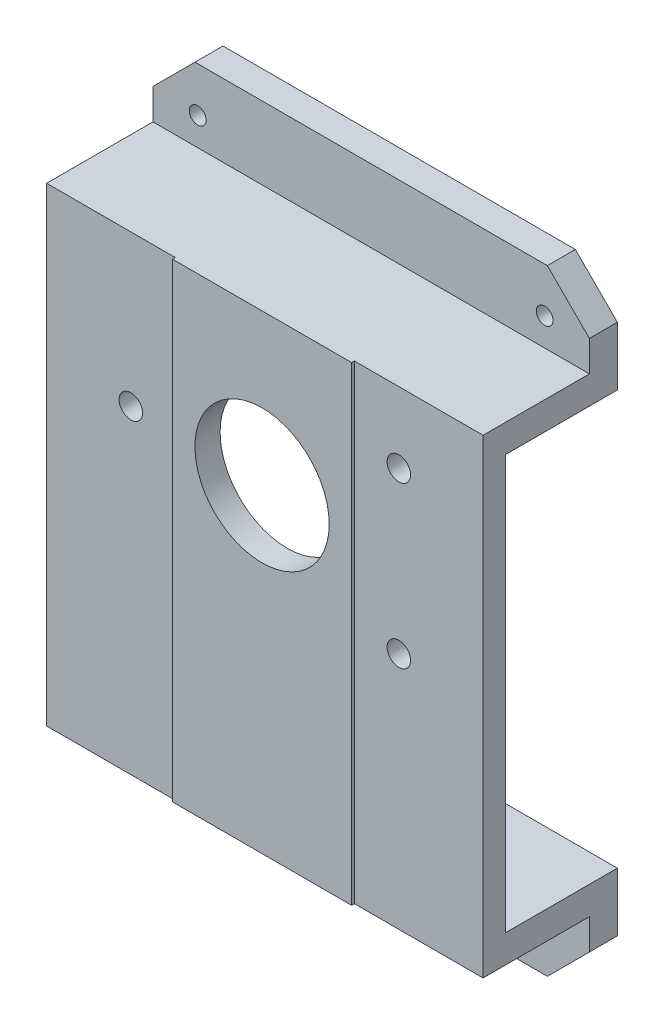
ISO-10303-21;
HEADER;
FILE_DESCRIPTION(('STEP AP214'),'2;1');
FILE_NAME('part.step','',(''),(''),'','','');
FILE_SCHEMA(('AUTOMOTIVE_DESIGN { 1 0 10303 214 1 1 1 1 }'));
ENDSEC;
DATA;
#1=APPLICATION_CONTEXT('core data for automotive mechanical design processes');
#2=APPLICATION_PROTOCOL_DEFINITION('international standard','automotive_design',2000,#1);
#3=PRODUCT_CONTEXT('',#1,'mechanical');
#4=PRODUCT('Part','Part','',(#3));
#5=PRODUCT_RELATED_PRODUCT_CATEGORY('part','',(#4));
#6=PRODUCT_DEFINITION_FORMATION('','',#4);
#7=PRODUCT_DEFINITION_CONTEXT('part definition',#1,'design');
#8=PRODUCT_DEFINITION('design','',#6,#7);
#9=PRODUCT_DEFINITION_SHAPE('','',#8);
#10=(LENGTH_UNIT() NAMED_UNIT(*) SI_UNIT(.MILLI.,.METRE.));
#11=(NAMED_UNIT(*) PLANE_ANGLE_UNIT() SI_UNIT($,.RADIAN.));
#12=(NAMED_UNIT(*) SI_UNIT($,.STERADIAN.) SOLID_ANGLE_UNIT());
#13=UNCERTAINTY_MEASURE_WITH_UNIT(LENGTH_MEASURE(1.E-05),#10,'distance_accuracy_value','');
#14=(GEOMETRIC_REPRESENTATION_CONTEXT(3) GLOBAL_UNCERTAINTY_ASSIGNED_CONTEXT((#13)) GLOBAL_UNIT_ASSIGNED_CONTEXT((#10,
#11,#12)) REPRESENTATION_CONTEXT('',''));
#15=CARTESIAN_POINT('',(0.,0.,0.));
#16=DIRECTION('',(0.,0.,1.));
#17=DIRECTION('',(1.,0.,0.));
#18=AXIS2_PLACEMENT_3D('',#15,#16,#17);
#19=CARTESIAN_POINT('',(126.361318671366,42.,24.));
#20=DIRECTION('',(0.,0.,1.));
#21=DIRECTION('',(0.,-1.,0.));
#22=AXIS2_PLACEMENT_3D('',#19,#20,#21);
#23=PLANE('',#22);
#24=CARTESIAN_POINT('',(-23.95,14.9999999999932,24.));
#25=DIRECTION('',(0.,0.,1.));
#26=DIRECTION('',(1.,0.,0.));
#27=AXIS2_PLACEMENT_3D('',#24,#25,#26);
#28=CIRCLE('',#27,2.1);
#29=CARTESIAN_POINT('',(-21.85,14.9999999999932,24.));
#30=VERTEX_POINT('',#29);
#31=EDGE_CURVE('E389',#30,#30,#28,.T.);
#32=ORIENTED_EDGE('',*,*,#31,.F.);
#33=EDGE_LOOP('',(#32));
#34=FACE_BOUND('',#33,.T.);
#35=DIRECTION('',(0.,-1.,0.));
#36=VECTOR('',#35,1.);
#37=CARTESIAN_POINT('',(-16.,42.,24.));
#38=LINE('',#37,#36);
#39=CARTESIAN_POINT('',(-16.,42.,24.));
#40=VERTEX_POINT('',#39);
#41=CARTESIAN_POINT('',(-16.,-42.,24.));
#42=VERTEX_POINT('',#41);
#43=EDGE_CURVE('E194',#40,#42,#38,.T.);
#44=ORIENTED_EDGE('',*,*,#43,.F.);
#45=DIRECTION('',(-1.,0.,0.));
#46=VECTOR('',#45,1.);
#47=CARTESIAN_POINT('',(126.361318671366,42.,24.));
#48=LINE('',#47,#46);
#49=CARTESIAN_POINT('',(-39.,42.,24.));
#50=VERTEX_POINT('',#49);
#51=EDGE_CURVE('E274',#40,#50,#48,.T.);
#52=ORIENTED_EDGE('',*,*,#51,.T.);
#53=DIRECTION('',(0.,1.,0.));
#54=VECTOR('',#53,1.);
#55=CARTESIAN_POINT('',(-39.,42.,24.));
#56=LINE('',#55,#54);
#57=CARTESIAN_POINT('',(-39.,-42.,24.));
#58=VERTEX_POINT('',#57);
#59=EDGE_CURVE('E266',#58,#50,#56,.T.);
#60=ORIENTED_EDGE('',*,*,#59,.F.);
#61=DIRECTION('',(-1.,0.,0.));
#62=VECTOR('',#61,1.);
#63=CARTESIAN_POINT('',(126.361318671366,-42.,24.));
#64=LINE('',#63,#62);
#65=EDGE_CURVE('E49',#42,#58,#64,.T.);
#66=ORIENTED_EDGE('',*,*,#65,.F.);
#67=EDGE_LOOP('',(#44,#52,#60,#66));
#68=FACE_BOUND('',#67,.T.);
#69=ADVANCED_FACE('F34',(#34,#68),#23,.T.);
#70=CARTESIAN_POINT('',(39.,42.,5.));
#71=DIRECTION('',(-1.,0.,0.));
#72=DIRECTION('',(0.,0.,1.));
#73=AXIS2_PLACEMENT_3D('',#70,#71,#72);
#74=PLANE('',#73);
#75=DIRECTION('',(0.,1.,0.));
#76=VECTOR('',#75,1.);
#77=CARTESIAN_POINT('',(39.,42.,0.));
#78=LINE('',#77,#76);
#79=CARTESIAN_POINT('',(39.,37.,0.));
#80=VERTEX_POINT('',#79);
#81=CARTESIAN_POINT('',(39.,47.4852813742386,0.));
#82=VERTEX_POINT('',#81);
#83=EDGE_CURVE('E287',#80,#82,#78,.T.);
#84=ORIENTED_EDGE('',*,*,#83,.T.);
#85=DIRECTION('',(0.,0.,-1.));
#86=VECTOR('',#85,1.);
#87=CARTESIAN_POINT('',(39.,47.4852813742386,5.));
#88=LINE('',#87,#86);
#89=CARTESIAN_POINT('',(39.,47.4852813742386,5.));
#90=VERTEX_POINT('',#89);
#91=EDGE_CURVE('E11',#90,#82,#88,.T.);
#92=ORIENTED_EDGE('',*,*,#91,.F.);
#93=DIRECTION('',(0.,1.,0.));
#94=VECTOR('',#93,1.);
#95=CARTESIAN_POINT('',(39.,42.,5.));
#96=LINE('',#95,#94);
#97=CARTESIAN_POINT('',(39.,42.,5.));
#98=VERTEX_POINT('',#97);
#99=EDGE_CURVE('E288',#98,#90,#96,.T.);
#100=ORIENTED_EDGE('',*,*,#99,.F.);
#101=DIRECTION('',(0.,0.,1.));
#102=VECTOR('',#101,1.);
#103=CARTESIAN_POINT('',(39.,42.,0.));
#104=LINE('',#103,#102);
#105=CARTESIAN_POINT('',(39.,42.,24.));
#106=VERTEX_POINT('',#105);
#107=EDGE_CURVE('E250',#98,#106,#104,.T.);
#108=ORIENTED_EDGE('',*,*,#107,.T.);
#109=DIRECTION('',(0.,-1.,0.));
#110=VECTOR('',#109,1.);
#111=CARTESIAN_POINT('',(39.,42.,24.));
#112=LINE('',#111,#110);
#113=CARTESIAN_POINT('',(39.,-42.,24.));
#114=VERTEX_POINT('',#113);
#115=EDGE_CURVE('E248',#106,#114,#112,.T.);
#116=ORIENTED_EDGE('',*,*,#115,.T.);
#117=DIRECTION('',(0.,0.,-1.));
#118=VECTOR('',#117,1.);
#119=CARTESIAN_POINT('',(39.,-42.,24.));
#120=LINE('',#119,#118);
#121=CARTESIAN_POINT('',(39.,-42.,5.));
#122=VERTEX_POINT('',#121);
#123=EDGE_CURVE('E245',#114,#122,#120,.T.);
#124=ORIENTED_EDGE('',*,*,#123,.T.);
#125=DIRECTION('',(0.,1.,0.));
#126=VECTOR('',#125,1.);
#127=CARTESIAN_POINT('',(39.,-42.,5.));
#128=LINE('',#127,#126);
#129=CARTESIAN_POINT('',(39.,-47.4852813742386,5.));
#130=VERTEX_POINT('',#129);
#131=EDGE_CURVE('E207',#130,#122,#128,.T.);
#132=ORIENTED_EDGE('',*,*,#131,.F.);
#133=DIRECTION('',(0.,0.,-1.));
#134=VECTOR('',#133,1.);
#135=CARTESIAN_POINT('',(39.,-47.4852813742386,5.));
#136=LINE('',#135,#134);
#137=CARTESIAN_POINT('',(39.,-47.4852813742386,0.));
#138=VERTEX_POINT('',#137);
#139=EDGE_CURVE('E234',#130,#138,#136,.T.);
#140=ORIENTED_EDGE('',*,*,#139,.T.);
#141=DIRECTION('',(0.,1.,0.));
#142=VECTOR('',#141,1.);
#143=CARTESIAN_POINT('',(39.,-42.,0.));
#144=LINE('',#143,#142);
#145=CARTESIAN_POINT('',(39.,-37.,0.));
#146=VERTEX_POINT('',#145);
#147=EDGE_CURVE('E243',#138,#146,#144,.T.);
#148=ORIENTED_EDGE('',*,*,#147,.T.);
#149=DIRECTION('',(0.,0.,1.));
#150=VECTOR('',#149,1.);
#151=CARTESIAN_POINT('',(39.,-37.,0.));
#152=LINE('',#151,#150);
#153=CARTESIAN_POINT('',(39.,-37.,20.));
#154=VERTEX_POINT('',#153);
#155=EDGE_CURVE('E240',#146,#154,#152,.T.);
#156=ORIENTED_EDGE('',*,*,#155,.T.);
#157=DIRECTION('',(0.,1.,0.));
#158=VECTOR('',#157,1.);
#159=CARTESIAN_POINT('',(39.,-37.,20.));
#160=LINE('',#159,#158);
#161=CARTESIAN_POINT('',(39.,37.,20.));
#162=VERTEX_POINT('',#161);
#163=EDGE_CURVE('E238',#154,#162,#160,.T.);
#164=ORIENTED_EDGE('',*,*,#163,.T.);
#165=DIRECTION('',(0.,0.,-1.));
#166=VECTOR('',#165,1.);
#167=CARTESIAN_POINT('',(39.,37.,20.));
#168=LINE('',#167,#166);
#169=EDGE_CURVE('E252',#162,#80,#168,.T.);
#170=ORIENTED_EDGE('',*,*,#169,.T.);
#171=EDGE_LOOP('',(#84,#92,#100,#108,#116,#124,#132,#140,#148,#156,#164,#170));
#172=FACE_BOUND('',#171,.T.);
#173=ADVANCED_FACE('F36',(#172),#74,.F.);
#174=CARTESIAN_POINT('',(39.,47.4852813742386,5.));
#175=DIRECTION('',(-0.707106781186548,-0.707106781186546,0.));
#176=DIRECTION('',(0.707106781186547,-0.707106781186549,0.));
#177=AXIS2_PLACEMENT_3D('',#174,#175,#176);
#178=PLANE('',#177);
#179=DIRECTION('',(-0.707106781186546,0.707106781186548,0.));
#180=VECTOR('',#179,1.);
#181=CARTESIAN_POINT('',(39.,47.4852813742386,0.));
#182=LINE('',#181,#180);
#183=CARTESIAN_POINT('',(31.4852813742386,55.,0.));
#184=VERTEX_POINT('',#183);
#185=EDGE_CURVE('E307',#82,#184,#182,.T.);
#186=ORIENTED_EDGE('',*,*,#185,.T.);
#187=DIRECTION('',(0.,0.,-1.));
#188=VECTOR('',#187,1.);
#189=CARTESIAN_POINT('',(31.4852813742386,55.,5.));
#190=LINE('',#189,#188);
#191=CARTESIAN_POINT('',(31.4852813742386,55.,5.));
#192=VERTEX_POINT('',#191);
#193=EDGE_CURVE('E42',#192,#184,#190,.T.);
#194=ORIENTED_EDGE('',*,*,#193,.F.);
#195=DIRECTION('',(-0.707106781186546,0.707106781186548,0.));
#196=VECTOR('',#195,1.);
#197=CARTESIAN_POINT('',(39.,47.4852813742386,5.));
#198=LINE('',#197,#196);
#199=EDGE_CURVE('E291',#90,#192,#198,.T.);
#200=ORIENTED_EDGE('',*,*,#199,.F.);
#201=ORIENTED_EDGE('',*,*,#91,.T.);
#202=EDGE_LOOP('',(#186,#194,#200,#201));
#203=FACE_BOUND('',#202,.T.);
#204=ADVANCED_FACE('F342',(#203),#178,.F.);
#205=CARTESIAN_POINT('',(31.4852813742386,55.,5.));
#206=DIRECTION('',(0.,-1.,0.));
#207=DIRECTION('',(1.,0.,0.));
#208=AXIS2_PLACEMENT_3D('',#205,#206,#207);
#209=PLANE('',#208);
#210=DIRECTION('',(-1.,0.,0.));
#211=VECTOR('',#210,1.);
#212=CARTESIAN_POINT('',(31.4852813742386,55.,0.));
#213=LINE('',#212,#211);
#214=CARTESIAN_POINT('',(-31.4852813742386,55.,0.));
#215=VERTEX_POINT('',#214);
#216=EDGE_CURVE('E309',#184,#215,#213,.T.);
#217=ORIENTED_EDGE('',*,*,#216,.T.);
#218=DIRECTION('',(0.,0.,-1.));
#219=VECTOR('',#218,1.);
#220=CARTESIAN_POINT('',(-31.4852813742386,55.,5.));
#221=LINE('',#220,#219);
#222=CARTESIAN_POINT('',(-31.4852813742386,55.,5.));
#223=VERTEX_POINT('',#222);
#224=EDGE_CURVE('E316',#223,#215,#221,.T.);
#225=ORIENTED_EDGE('',*,*,#224,.F.);
#226=DIRECTION('',(-1.,0.,0.));
#227=VECTOR('',#226,1.);
#228=CARTESIAN_POINT('',(31.4852813742386,55.,5.));
#229=LINE('',#228,#227);
#230=EDGE_CURVE('E294',#192,#223,#229,.T.);
#231=ORIENTED_EDGE('',*,*,#230,.F.);
#232=ORIENTED_EDGE('',*,*,#193,.T.);
#233=EDGE_LOOP('',(#217,#225,#231,#232));
#234=FACE_BOUND('',#233,.T.);
#235=ADVANCED_FACE('F323',(#234),#209,.F.);
#236=CARTESIAN_POINT('',(-39.,47.4852813742385,5.));
#237=DIRECTION('',(0.70710678118655,-0.707106781186545,0.));
#238=DIRECTION('',(0.707106781186545,0.70710678118655,0.));
#239=AXIS2_PLACEMENT_3D('',#236,#237,#238);
#240=PLANE('',#239);
#241=DIRECTION('',(-0.707106781186545,-0.70710678118655,0.));
#242=VECTOR('',#241,1.);
#243=CARTESIAN_POINT('',(-39.,47.4852813742385,0.));
#244=LINE('',#243,#242);
#245=CARTESIAN_POINT('',(-39.,47.4852813742385,0.));
#246=VERTEX_POINT('',#245);
#247=EDGE_CURVE('E311',#215,#246,#244,.T.);
#248=ORIENTED_EDGE('',*,*,#247,.T.);
#249=DIRECTION('',(0.,0.,-1.));
#250=VECTOR('',#249,1.);
#251=CARTESIAN_POINT('',(-39.,47.4852813742385,5.));
#252=LINE('',#251,#250);
#253=CARTESIAN_POINT('',(-39.,47.4852813742385,5.));
#254=VERTEX_POINT('',#253);
#255=EDGE_CURVE('E304',#254,#246,#252,.T.);
#256=ORIENTED_EDGE('',*,*,#255,.F.);
#257=DIRECTION('',(-0.707106781186545,-0.70710678118655,0.));
#258=VECTOR('',#257,1.);
#259=CARTESIAN_POINT('',(-39.,47.4852813742385,5.));
#260=LINE('',#259,#258);
#261=EDGE_CURVE('E296',#223,#254,#260,.T.);
#262=ORIENTED_EDGE('',*,*,#261,.F.);
#263=ORIENTED_EDGE('',*,*,#224,.T.);
#264=EDGE_LOOP('',(#248,#256,#262,#263));
#265=FACE_BOUND('',#264,.T.);
#266=ADVANCED_FACE('F332',(#265),#240,.F.);
#267=CARTESIAN_POINT('',(-39.,42.,5.));
#268=DIRECTION('',(1.,0.,0.));
#269=DIRECTION('',(0.,0.,-1.));
#270=AXIS2_PLACEMENT_3D('',#267,#268,#269);
#271=PLANE('',#270);
#272=DIRECTION('',(0.,-1.,0.));
#273=VECTOR('',#272,1.);
#274=CARTESIAN_POINT('',(-39.,42.,0.));
#275=LINE('',#274,#273);
#276=CARTESIAN_POINT('',(-39.,37.,0.));
#277=VERTEX_POINT('',#276);
#278=EDGE_CURVE('E292',#246,#277,#275,.T.);
#279=ORIENTED_EDGE('',*,*,#278,.T.);
#280=DIRECTION('',(0.,0.,1.));
#281=VECTOR('',#280,1.);
#282=CARTESIAN_POINT('',(-39.,37.,20.));
#283=LINE('',#282,#281);
#284=CARTESIAN_POINT('',(-39.,37.,20.));
#285=VERTEX_POINT('',#284);
#286=EDGE_CURVE('E237',#277,#285,#283,.T.);
#287=ORIENTED_EDGE('',*,*,#286,.T.);
#288=DIRECTION('',(0.,-1.,0.));
#289=VECTOR('',#288,1.);
#290=CARTESIAN_POINT('',(-39.,-37.,20.));
#291=LINE('',#290,#289);
#292=CARTESIAN_POINT('',(-39.,-37.,20.));
#293=VERTEX_POINT('',#292);
#294=EDGE_CURVE('E255',#285,#293,#291,.T.);
#295=ORIENTED_EDGE('',*,*,#294,.T.);
#296=DIRECTION('',(0.,0.,-1.));
#297=VECTOR('',#296,1.);
#298=CARTESIAN_POINT('',(-39.,-37.,0.));
#299=LINE('',#298,#297);
#300=CARTESIAN_POINT('',(-39.,-37.,0.));
#301=VERTEX_POINT('',#300);
#302=EDGE_CURVE('E258',#293,#301,#299,.T.);
#303=ORIENTED_EDGE('',*,*,#302,.T.);
#304=DIRECTION('',(0.,-1.,0.));
#305=VECTOR('',#304,1.);
#306=CARTESIAN_POINT('',(-39.,-42.,0.));
#307=LINE('',#306,#305);
#308=CARTESIAN_POINT('',(-39.,-47.4852813742385,0.));
#309=VERTEX_POINT('',#308);
#310=EDGE_CURVE('E261',#301,#309,#307,.T.);
#311=ORIENTED_EDGE('',*,*,#310,.T.);
#312=DIRECTION('',(0.,0.,-1.));
#313=VECTOR('',#312,1.);
#314=CARTESIAN_POINT('',(-39.,-47.4852813742385,5.));
#315=LINE('',#314,#313);
#316=CARTESIAN_POINT('',(-39.,-47.4852813742385,5.));
#317=VERTEX_POINT('',#316);
#318=EDGE_CURVE('E231',#317,#309,#315,.T.);
#319=ORIENTED_EDGE('',*,*,#318,.F.);
#320=DIRECTION('',(0.,-1.,0.));
#321=VECTOR('',#320,1.);
#322=CARTESIAN_POINT('',(-39.,-42.,5.));
#323=LINE('',#322,#321);
#324=CARTESIAN_POINT('',(-39.,-42.,5.));
#325=VERTEX_POINT('',#324);
#326=EDGE_CURVE('E214',#325,#317,#323,.T.);
#327=ORIENTED_EDGE('',*,*,#326,.F.);
#328=DIRECTION('',(0.,0.,1.));
#329=VECTOR('',#328,1.);
#330=CARTESIAN_POINT('',(-39.,-42.,24.));
#331=LINE('',#330,#329);
#332=EDGE_CURVE('E263',#325,#58,#331,.T.);
#333=ORIENTED_EDGE('',*,*,#332,.T.);
#334=ORIENTED_EDGE('',*,*,#59,.T.);
#335=DIRECTION('',(0.,0.,-1.));
#336=VECTOR('',#335,1.);
#337=CARTESIAN_POINT('',(-39.,42.,0.));
#338=LINE('',#337,#336);
#339=CARTESIAN_POINT('',(-39.,42.,5.));
#340=VERTEX_POINT('',#339);
#341=EDGE_CURVE('E269',#50,#340,#338,.T.);
#342=ORIENTED_EDGE('',*,*,#341,.T.);
#343=DIRECTION('',(0.,-1.,0.));
#344=VECTOR('',#343,1.);
#345=CARTESIAN_POINT('',(-39.,42.,5.));
#346=LINE('',#345,#344);
#347=EDGE_CURVE('E298',#254,#340,#346,.T.);
#348=ORIENTED_EDGE('',*,*,#347,.F.);
#349=ORIENTED_EDGE('',*,*,#255,.T.);
#350=EDGE_LOOP('',(#279,#287,#295,#303,#311,#319,#327,#333,#334,#342,#348,#349));
#351=FACE_BOUND('',#350,.T.);
#352=ADVANCED_FACE('F336',(#351),#271,.F.);
#353=CARTESIAN_POINT('',(0.,0.,5.));
#354=DIRECTION('',(0.,0.,1.));
#355=DIRECTION('',(1.,0.,0.));
#356=AXIS2_PLACEMENT_3D('',#353,#354,#355);
#357=PLANE('',#356);
#358=CARTESIAN_POINT('',(31.,46.9999999999932,5.));
#359=DIRECTION('',(0.,0.,1.));
#360=DIRECTION('',(1.,0.,0.));
#361=AXIS2_PLACEMENT_3D('',#358,#359,#360);
#362=CIRCLE('',#361,1.5);
#363=CARTESIAN_POINT('',(32.5,46.9999999999932,5.));
#364=VERTEX_POINT('',#363);
#365=EDGE_CURVE('E426',#364,#364,#362,.T.);
#366=ORIENTED_EDGE('',*,*,#365,.F.);
#367=EDGE_LOOP('',(#366));
#368=FACE_BOUND('',#367,.T.);
#369=CARTESIAN_POINT('',(-31.,46.9999999999932,5.));
#370=DIRECTION('',(0.,0.,1.));
#371=DIRECTION('',(1.,0.,0.));
#372=AXIS2_PLACEMENT_3D('',#369,#370,#371);
#373=CIRCLE('',#372,1.5);
#374=CARTESIAN_POINT('',(-29.5,46.9999999999932,5.));
#375=VERTEX_POINT('',#374);
#376=EDGE_CURVE('E410',#375,#375,#373,.T.);
#377=ORIENTED_EDGE('',*,*,#376,.F.);
#378=EDGE_LOOP('',(#377));
#379=FACE_BOUND('',#378,.T.);
#380=ORIENTED_EDGE('',*,*,#99,.T.);
#381=ORIENTED_EDGE('',*,*,#199,.T.);
#382=ORIENTED_EDGE('',*,*,#230,.T.);
#383=ORIENTED_EDGE('',*,*,#261,.T.);
#384=ORIENTED_EDGE('',*,*,#347,.T.);
#385=DIRECTION('',(1.,0.,0.));
#386=VECTOR('',#385,1.);
#387=CARTESIAN_POINT('',(39.,42.,5.));
#388=LINE('',#387,#386);
#389=EDGE_CURVE('E301',#340,#98,#388,.T.);
#390=ORIENTED_EDGE('',*,*,#389,.T.);
#391=EDGE_LOOP('',(#380,#381,#382,#383,#384,#390));
#392=FACE_BOUND('',#391,.T.);
#393=ADVANCED_FACE('F339',(#368,#379,#392),#357,.T.);
#394=CARTESIAN_POINT('',(0.,0.,0.));
#395=DIRECTION('',(0.,0.,1.));
#396=DIRECTION('',(1.,0.,0.));
#397=AXIS2_PLACEMENT_3D('',#394,#395,#396);
#398=PLANE('',#397);
#399=CARTESIAN_POINT('',(31.,46.9999999999932,0.));
#400=DIRECTION('',(0.,0.,1.));
#401=DIRECTION('',(1.,0.,0.));
#402=AXIS2_PLACEMENT_3D('',#399,#400,#401);
#403=CIRCLE('',#402,1.5);
#404=CARTESIAN_POINT('',(32.5,46.9999999999932,0.));
#405=VERTEX_POINT('',#404);
#406=EDGE_CURVE('E413',#405,#405,#403,.F.);
#407=ORIENTED_EDGE('',*,*,#406,.F.);
#408=EDGE_LOOP('',(#407));
#409=FACE_BOUND('',#408,.T.);
#410=CARTESIAN_POINT('',(-31.,46.9999999999932,0.));
#411=DIRECTION('',(0.,0.,1.));
#412=DIRECTION('',(1.,0.,0.));
#413=AXIS2_PLACEMENT_3D('',#410,#411,#412);
#414=CIRCLE('',#413,1.5);
#415=CARTESIAN_POINT('',(-29.5,46.9999999999932,0.));
#416=VERTEX_POINT('',#415);
#417=EDGE_CURVE('E394',#416,#416,#414,.F.);
#418=ORIENTED_EDGE('',*,*,#417,.F.);
#419=EDGE_LOOP('',(#418));
#420=FACE_BOUND('',#419,.T.);
#421=ORIENTED_EDGE('',*,*,#83,.F.);
#422=DIRECTION('',(-1.,0.,0.));
#423=VECTOR('',#422,1.);
#424=CARTESIAN_POINT('',(126.361318671366,37.,0.));
#425=LINE('',#424,#423);
#426=EDGE_CURVE('E272',#80,#277,#425,.T.);
#427=ORIENTED_EDGE('',*,*,#426,.T.);
#428=ORIENTED_EDGE('',*,*,#278,.F.);
#429=ORIENTED_EDGE('',*,*,#247,.F.);
#430=ORIENTED_EDGE('',*,*,#216,.F.);
#431=ORIENTED_EDGE('',*,*,#185,.F.);
#432=EDGE_LOOP('',(#421,#427,#428,#429,#430,#431));
#433=FACE_BOUND('',#432,.T.);
#434=ADVANCED_FACE('F328',(#409,#420,#433),#398,.F.);
#435=CARTESIAN_POINT('',(126.361318671366,42.,0.));
#436=DIRECTION('',(0.,1.,0.));
#437=DIRECTION('',(0.,0.,1.));
#438=AXIS2_PLACEMENT_3D('',#435,#436,#437);
#439=PLANE('',#438);
#440=ORIENTED_EDGE('',*,*,#389,.F.);
#441=ORIENTED_EDGE('',*,*,#341,.F.);
#442=ORIENTED_EDGE('',*,*,#51,.F.);
#443=DIRECTION('',(0.,0.,-1.));
#444=VECTOR('',#443,1.);
#445=CARTESIAN_POINT('',(-16.,42.,24.5));
#446=LINE('',#445,#444);
#447=CARTESIAN_POINT('',(-16.,42.,24.5));
#448=VERTEX_POINT('',#447);
#449=EDGE_CURVE('E378',#448,#40,#446,.T.);
#450=ORIENTED_EDGE('',*,*,#449,.F.);
#451=DIRECTION('',(-1.,0.,0.));
#452=VECTOR('',#451,1.);
#453=CARTESIAN_POINT('',(-16.,42.,24.5));
#454=LINE('',#453,#452);
#455=CARTESIAN_POINT('',(16.,42.,24.5));
#456=VERTEX_POINT('',#455);
#457=EDGE_CURVE('E188',#456,#448,#454,.T.);
#458=ORIENTED_EDGE('',*,*,#457,.F.);
#459=DIRECTION('',(0.,0.,-1.));
#460=VECTOR('',#459,1.);
#461=CARTESIAN_POINT('',(16.,42.,24.5));
#462=LINE('',#461,#460);
#463=CARTESIAN_POINT('',(16.,42.,24.));
#464=VERTEX_POINT('',#463);
#465=EDGE_CURVE('E200',#456,#464,#462,.T.);
#466=ORIENTED_EDGE('',*,*,#465,.T.);
#467=EDGE_CURVE('E241',#106,#464,#48,.T.);
#468=ORIENTED_EDGE('',*,*,#467,.F.);
#469=ORIENTED_EDGE('',*,*,#107,.F.);
#470=EDGE_LOOP('',(#440,#441,#442,#450,#458,#466,#468,#469));
#471=FACE_BOUND('',#470,.T.);
#472=ADVANCED_FACE('F377',(#471),#439,.T.);
#473=CARTESIAN_POINT('',(23.95,29.3499999999932,24.));
#474=DIRECTION('',(0.,0.,1.));
#475=DIRECTION('',(1.,0.,0.));
#476=AXIS2_PLACEMENT_3D('',#473,#474,#475);
#477=CIRCLE('',#476,2.1);
#478=CARTESIAN_POINT('',(26.05,29.3499999999932,24.));
#479=VERTEX_POINT('',#478);
#480=EDGE_CURVE('E400',#479,#479,#477,.T.);
#481=ORIENTED_EDGE('',*,*,#480,.F.);
#482=EDGE_LOOP('',(#481));
#483=FACE_BOUND('',#482,.T.);
#484=CARTESIAN_POINT('',(23.95,0.649999999993176,24.));
#485=DIRECTION('',(0.,0.,1.));
#486=DIRECTION('',(1.,0.,0.));
#487=AXIS2_PLACEMENT_3D('',#484,#485,#486);
#488=CIRCLE('',#487,2.1);
#489=CARTESIAN_POINT('',(26.05,0.649999999993176,24.));
#490=VERTEX_POINT('',#489);
#491=EDGE_CURVE('E393',#490,#490,#488,.T.);
#492=ORIENTED_EDGE('',*,*,#491,.F.);
#493=EDGE_LOOP('',(#492));
#494=FACE_BOUND('',#493,.T.);
#495=DIRECTION('',(0.,1.,0.));
#496=VECTOR('',#495,1.);
#497=CARTESIAN_POINT('',(16.,42.,24.));
#498=LINE('',#497,#496);
#499=CARTESIAN_POINT('',(16.,-42.,24.));
#500=VERTEX_POINT('',#499);
#501=EDGE_CURVE('E57',#500,#464,#498,.T.);
#502=ORIENTED_EDGE('',*,*,#501,.F.);
#503=EDGE_CURVE('E275',#114,#500,#64,.T.);
#504=ORIENTED_EDGE('',*,*,#503,.F.);
#505=ORIENTED_EDGE('',*,*,#115,.F.);
#506=ORIENTED_EDGE('',*,*,#467,.T.);
#507=EDGE_LOOP('',(#502,#504,#505,#506));
#508=FACE_BOUND('',#507,.T.);
#509=ADVANCED_FACE('F453',(#483,#494,#508),#23,.T.);
#510=CARTESIAN_POINT('',(126.361318671366,-42.,24.));
#511=DIRECTION('',(0.,-1.,0.));
#512=DIRECTION('',(0.,0.,-1.));
#513=AXIS2_PLACEMENT_3D('',#510,#511,#512);
#514=PLANE('',#513);
#515=DIRECTION('',(-1.,0.,0.));
#516=VECTOR('',#515,1.);
#517=CARTESIAN_POINT('',(39.,-42.,5.));
#518=LINE('',#517,#516);
#519=EDGE_CURVE('E211',#122,#325,#518,.T.);
#520=ORIENTED_EDGE('',*,*,#519,.F.);
#521=ORIENTED_EDGE('',*,*,#123,.F.);
#522=ORIENTED_EDGE('',*,*,#503,.T.);
#523=DIRECTION('',(0.,0.,-1.));
#524=VECTOR('',#523,1.);
#525=CARTESIAN_POINT('',(16.,-42.,24.5));
#526=LINE('',#525,#524);
#527=CARTESIAN_POINT('',(16.,-42.,24.5));
#528=VERTEX_POINT('',#527);
#529=EDGE_CURVE('E178',#528,#500,#526,.T.);
#530=ORIENTED_EDGE('',*,*,#529,.F.);
#531=DIRECTION('',(1.,0.,0.));
#532=VECTOR('',#531,1.);
#533=CARTESIAN_POINT('',(-16.,-42.,24.5));
#534=LINE('',#533,#532);
#535=CARTESIAN_POINT('',(-16.,-42.,24.5));
#536=VERTEX_POINT('',#535);
#537=EDGE_CURVE('E171',#536,#528,#534,.T.);
#538=ORIENTED_EDGE('',*,*,#537,.F.);
#539=DIRECTION('',(0.,0.,-1.));
#540=VECTOR('',#539,1.);
#541=CARTESIAN_POINT('',(-16.,-42.,24.5));
#542=LINE('',#541,#540);
#543=EDGE_CURVE('E175',#536,#42,#542,.T.);
#544=ORIENTED_EDGE('',*,*,#543,.T.);
#545=ORIENTED_EDGE('',*,*,#65,.T.);
#546=ORIENTED_EDGE('',*,*,#332,.F.);
#547=EDGE_LOOP('',(#520,#521,#522,#530,#538,#544,#545,#546));
#548=FACE_BOUND('',#547,.T.);
#549=ADVANCED_FACE('F173',(#548),#514,.T.);
#550=CARTESIAN_POINT('',(126.361318671366,-42.,0.));
#551=DIRECTION('',(0.,0.,-1.));
#552=DIRECTION('',(-1.,0.,0.));
#553=AXIS2_PLACEMENT_3D('',#550,#551,#552);
#554=PLANE('',#553);
#555=CARTESIAN_POINT('',(-31.,-47.0000000000068,0.));
#556=DIRECTION('',(0.,0.,-1.));
#557=DIRECTION('',(-1.,0.,0.));
#558=AXIS2_PLACEMENT_3D('',#555,#556,#557);
#559=CIRCLE('',#558,1.5);
#560=CARTESIAN_POINT('',(-32.5,-47.0000000000068,0.));
#561=VERTEX_POINT('',#560);
#562=EDGE_CURVE('E414',#561,#561,#559,.F.);
#563=ORIENTED_EDGE('',*,*,#562,.T.);
#564=EDGE_LOOP('',(#563));
#565=FACE_BOUND('',#564,.T.);
#566=CARTESIAN_POINT('',(31.,-47.0000000000068,0.));
#567=DIRECTION('',(0.,0.,-1.));
#568=DIRECTION('',(-1.,0.,0.));
#569=AXIS2_PLACEMENT_3D('',#566,#567,#568);
#570=CIRCLE('',#569,1.5);
#571=CARTESIAN_POINT('',(29.5,-47.0000000000068,0.));
#572=VERTEX_POINT('',#571);
#573=EDGE_CURVE('E420',#572,#572,#570,.F.);
#574=ORIENTED_EDGE('',*,*,#573,.T.);
#575=EDGE_LOOP('',(#574));
#576=FACE_BOUND('',#575,.T.);
#577=ORIENTED_EDGE('',*,*,#147,.F.);
#578=DIRECTION('',(0.707106781186546,0.707106781186548,0.));
#579=VECTOR('',#578,1.);
#580=CARTESIAN_POINT('',(39.,-47.4852813742386,0.));
#581=LINE('',#580,#579);
#582=CARTESIAN_POINT('',(31.4852813742386,-55.,0.));
#583=VERTEX_POINT('',#582);
#584=EDGE_CURVE('E198',#583,#138,#581,.T.);
#585=ORIENTED_EDGE('',*,*,#584,.F.);
#586=DIRECTION('',(1.,0.,0.));
#587=VECTOR('',#586,1.);
#588=CARTESIAN_POINT('',(31.4852813742386,-55.,0.));
#589=LINE('',#588,#587);
#590=CARTESIAN_POINT('',(-31.4852813742386,-55.,0.));
#591=VERTEX_POINT('',#590);
#592=EDGE_CURVE('E208',#591,#583,#589,.T.);
#593=ORIENTED_EDGE('',*,*,#592,.F.);
#594=DIRECTION('',(0.707106781186545,-0.70710678118655,0.));
#595=VECTOR('',#594,1.);
#596=CARTESIAN_POINT('',(-39.,-47.4852813742385,0.));
#597=LINE('',#596,#595);
#598=EDGE_CURVE('E223',#309,#591,#597,.T.);
#599=ORIENTED_EDGE('',*,*,#598,.F.);
#600=ORIENTED_EDGE('',*,*,#310,.F.);
#601=DIRECTION('',(-1.,0.,0.));
#602=VECTOR('',#601,1.);
#603=CARTESIAN_POINT('',(126.361318671366,-37.,0.));
#604=LINE('',#603,#602);
#605=EDGE_CURVE('E277',#146,#301,#604,.T.);
#606=ORIENTED_EDGE('',*,*,#605,.F.);
#607=EDGE_LOOP('',(#577,#585,#593,#599,#600,#606));
#608=FACE_BOUND('',#607,.T.);
#609=ADVANCED_FACE('F363',(#565,#576,#608),#554,.T.);
#610=CARTESIAN_POINT('',(126.361318671366,-37.,0.));
#611=DIRECTION('',(0.,1.,0.));
#612=DIRECTION('',(0.,0.,1.));
#613=AXIS2_PLACEMENT_3D('',#610,#611,#612);
#614=PLANE('',#613);
#615=ORIENTED_EDGE('',*,*,#155,.F.);
#616=ORIENTED_EDGE('',*,*,#605,.T.);
#617=ORIENTED_EDGE('',*,*,#302,.F.);
#618=DIRECTION('',(-1.,0.,0.));
#619=VECTOR('',#618,1.);
#620=CARTESIAN_POINT('',(126.361318671366,-37.,20.));
#621=LINE('',#620,#619);
#622=EDGE_CURVE('E279',#154,#293,#621,.T.);
#623=ORIENTED_EDGE('',*,*,#622,.F.);
#624=EDGE_LOOP('',(#615,#616,#617,#623));
#625=FACE_BOUND('',#624,.T.);
#626=ADVANCED_FACE('F358',(#625),#614,.T.);
#627=CARTESIAN_POINT('',(126.361318671366,-37.,20.));
#628=DIRECTION('',(0.,0.,-1.));
#629=DIRECTION('',(-1.,0.,0.));
#630=AXIS2_PLACEMENT_3D('',#627,#628,#629);
#631=PLANE('',#630);
#632=CARTESIAN_POINT('',(-23.95,14.9999999999932,20.));
#633=DIRECTION('',(0.,0.,-1.));
#634=DIRECTION('',(-1.,0.,0.));
#635=AXIS2_PLACEMENT_3D('',#632,#633,#634);
#636=CIRCLE('',#635,2.1);
#637=CARTESIAN_POINT('',(-26.05,14.9999999999932,20.));
#638=VERTEX_POINT('',#637);
#639=EDGE_CURVE('E403',#638,#638,#636,.F.);
#640=ORIENTED_EDGE('',*,*,#639,.T.);
#641=EDGE_LOOP('',(#640));
#642=FACE_BOUND('',#641,.T.);
#643=CARTESIAN_POINT('',(23.95,29.3499999999932,20.));
#644=DIRECTION('',(0.,0.,-1.));
#645=DIRECTION('',(-1.,0.,0.));
#646=AXIS2_PLACEMENT_3D('',#643,#644,#645);
#647=CIRCLE('',#646,2.1);
#648=CARTESIAN_POINT('',(21.85,29.3499999999932,20.));
#649=VERTEX_POINT('',#648);
#650=EDGE_CURVE('E397',#649,#649,#647,.F.);
#651=ORIENTED_EDGE('',*,*,#650,.T.);
#652=EDGE_LOOP('',(#651));
#653=FACE_BOUND('',#652,.T.);
#654=CARTESIAN_POINT('',(23.95,0.649999999993176,20.));
#655=DIRECTION('',(0.,0.,-1.));
#656=DIRECTION('',(-1.,0.,0.));
#657=AXIS2_PLACEMENT_3D('',#654,#655,#656);
#658=CIRCLE('',#657,2.1);
#659=CARTESIAN_POINT('',(21.85,0.649999999993176,20.));
#660=VERTEX_POINT('',#659);
#661=EDGE_CURVE('E390',#660,#660,#658,.F.);
#662=ORIENTED_EDGE('',*,*,#661,.T.);
#663=EDGE_LOOP('',(#662));
#664=FACE_BOUND('',#663,.T.);
#665=CARTESIAN_POINT('',(0.,14.9999999999932,20.));
#666=DIRECTION('',(0.,0.,-1.));
#667=DIRECTION('',(-1.,0.,0.));
#668=AXIS2_PLACEMENT_3D('',#665,#666,#667);
#669=CIRCLE('',#668,12.);
#670=CARTESIAN_POINT('',(-12.,14.9999999999932,20.));
#671=VERTEX_POINT('',#670);
#672=EDGE_CURVE('E195',#671,#671,#669,.F.);
#673=ORIENTED_EDGE('',*,*,#672,.T.);
#674=EDGE_LOOP('',(#673));
#675=FACE_BOUND('',#674,.T.);
#676=ORIENTED_EDGE('',*,*,#163,.F.);
#677=ORIENTED_EDGE('',*,*,#622,.T.);
#678=ORIENTED_EDGE('',*,*,#294,.F.);
#679=DIRECTION('',(-1.,0.,0.));
#680=VECTOR('',#679,1.);
#681=CARTESIAN_POINT('',(126.361318671366,37.,20.));
#682=LINE('',#681,#680);
#683=EDGE_CURVE('E281',#162,#285,#682,.T.);
#684=ORIENTED_EDGE('',*,*,#683,.F.);
#685=EDGE_LOOP('',(#676,#677,#678,#684));
#686=FACE_BOUND('',#685,.T.);
#687=ADVANCED_FACE('F354',(#642,#653,#664,#675,#686),#631,.T.);
#688=CARTESIAN_POINT('',(126.361318671366,37.,20.));
#689=DIRECTION('',(0.,-1.,0.));
#690=DIRECTION('',(0.,0.,-1.));
#691=AXIS2_PLACEMENT_3D('',#688,#689,#690);
#692=PLANE('',#691);
#693=ORIENTED_EDGE('',*,*,#169,.F.);
#694=ORIENTED_EDGE('',*,*,#683,.T.);
#695=ORIENTED_EDGE('',*,*,#286,.F.);
#696=ORIENTED_EDGE('',*,*,#426,.F.);
#697=EDGE_LOOP('',(#693,#694,#695,#696));
#698=FACE_BOUND('',#697,.T.);
#699=ADVANCED_FACE('F348',(#698),#692,.T.);
#700=CARTESIAN_POINT('',(39.,-47.4852813742386,5.));
#701=DIRECTION('',(-0.707106781186548,0.707106781186546,0.));
#702=DIRECTION('',(-0.707106781186547,-0.707106781186549,0.));
#703=AXIS2_PLACEMENT_3D('',#700,#701,#702);
#704=PLANE('',#703);
#705=ORIENTED_EDGE('',*,*,#584,.T.);
#706=ORIENTED_EDGE('',*,*,#139,.F.);
#707=DIRECTION('',(0.707106781186546,0.707106781186548,0.));
#708=VECTOR('',#707,1.);
#709=CARTESIAN_POINT('',(39.,-47.4852813742386,5.));
#710=LINE('',#709,#708);
#711=CARTESIAN_POINT('',(31.4852813742386,-55.,5.));
#712=VERTEX_POINT('',#711);
#713=EDGE_CURVE('E204',#712,#130,#710,.T.);
#714=ORIENTED_EDGE('',*,*,#713,.F.);
#715=DIRECTION('',(0.,0.,-1.));
#716=VECTOR('',#715,1.);
#717=CARTESIAN_POINT('',(31.4852813742386,-55.,5.));
#718=LINE('',#717,#716);
#719=EDGE_CURVE('E220',#712,#583,#718,.T.);
#720=ORIENTED_EDGE('',*,*,#719,.T.);
#721=EDGE_LOOP('',(#705,#706,#714,#720));
#722=FACE_BOUND('',#721,.T.);
#723=ADVANCED_FACE('F509',(#722),#704,.F.);
#724=CARTESIAN_POINT('',(-39.,-47.4852813742385,5.));
#725=DIRECTION('',(0.70710678118655,0.707106781186545,0.));
#726=DIRECTION('',(-0.707106781186545,0.70710678118655,0.));
#727=AXIS2_PLACEMENT_3D('',#724,#725,#726);
#728=PLANE('',#727);
#729=ORIENTED_EDGE('',*,*,#598,.T.);
#730=DIRECTION('',(0.,0.,-1.));
#731=VECTOR('',#730,1.);
#732=CARTESIAN_POINT('',(-31.4852813742386,-55.,5.));
#733=LINE('',#732,#731);
#734=CARTESIAN_POINT('',(-31.4852813742386,-55.,5.));
#735=VERTEX_POINT('',#734);
#736=EDGE_CURVE('E228',#735,#591,#733,.T.);
#737=ORIENTED_EDGE('',*,*,#736,.F.);
#738=DIRECTION('',(0.707106781186545,-0.70710678118655,0.));
#739=VECTOR('',#738,1.);
#740=CARTESIAN_POINT('',(-39.,-47.4852813742385,5.));
#741=LINE('',#740,#739);
#742=EDGE_CURVE('E216',#317,#735,#741,.T.);
#743=ORIENTED_EDGE('',*,*,#742,.F.);
#744=ORIENTED_EDGE('',*,*,#318,.T.);
#745=EDGE_LOOP('',(#729,#737,#743,#744));
#746=FACE_BOUND('',#745,.T.);
#747=ADVANCED_FACE('F369',(#746),#728,.F.);
#748=CARTESIAN_POINT('',(31.4852813742386,-55.,5.));
#749=DIRECTION('',(0.,1.,0.));
#750=DIRECTION('',(-1.,0.,0.));
#751=AXIS2_PLACEMENT_3D('',#748,#749,#750);
#752=PLANE('',#751);
#753=ORIENTED_EDGE('',*,*,#592,.T.);
#754=ORIENTED_EDGE('',*,*,#719,.F.);
#755=DIRECTION('',(1.,0.,0.));
#756=VECTOR('',#755,1.);
#757=CARTESIAN_POINT('',(31.4852813742386,-55.,5.));
#758=LINE('',#757,#756);
#759=EDGE_CURVE('E218',#735,#712,#758,.T.);
#760=ORIENTED_EDGE('',*,*,#759,.F.);
#761=ORIENTED_EDGE('',*,*,#736,.T.);
#762=EDGE_LOOP('',(#753,#754,#760,#761));
#763=FACE_BOUND('',#762,.T.);
#764=ADVANCED_FACE('F502',(#763),#752,.F.);
#765=CARTESIAN_POINT('',(0.,0.,5.));
#766=DIRECTION('',(0.,0.,1.));
#767=DIRECTION('',(1.,0.,0.));
#768=AXIS2_PLACEMENT_3D('',#765,#766,#767);
#769=PLANE('',#768);
#770=CARTESIAN_POINT('',(-31.,-47.0000000000068,5.));
#771=DIRECTION('',(0.,0.,1.));
#772=DIRECTION('',(1.,0.,0.));
#773=AXIS2_PLACEMENT_3D('',#770,#771,#772);
#774=CIRCLE('',#773,1.5);
#775=CARTESIAN_POINT('',(-29.5,-47.0000000000068,5.));
#776=VERTEX_POINT('',#775);
#777=EDGE_CURVE('E417',#776,#776,#774,.T.);
#778=ORIENTED_EDGE('',*,*,#777,.F.);
#779=EDGE_LOOP('',(#778));
#780=FACE_BOUND('',#779,.T.);
#781=CARTESIAN_POINT('',(31.,-47.0000000000068,5.));
#782=DIRECTION('',(0.,0.,1.));
#783=DIRECTION('',(1.,0.,0.));
#784=AXIS2_PLACEMENT_3D('',#781,#782,#783);
#785=CIRCLE('',#784,1.5);
#786=CARTESIAN_POINT('',(32.5,-47.0000000000068,5.));
#787=VERTEX_POINT('',#786);
#788=EDGE_CURVE('E423',#787,#787,#785,.T.);
#789=ORIENTED_EDGE('',*,*,#788,.F.);
#790=EDGE_LOOP('',(#789));
#791=FACE_BOUND('',#790,.T.);
#792=ORIENTED_EDGE('',*,*,#713,.T.);
#793=ORIENTED_EDGE('',*,*,#131,.T.);
#794=ORIENTED_EDGE('',*,*,#519,.T.);
#795=ORIENTED_EDGE('',*,*,#326,.T.);
#796=ORIENTED_EDGE('',*,*,#742,.T.);
#797=ORIENTED_EDGE('',*,*,#759,.T.);
#798=EDGE_LOOP('',(#792,#793,#794,#795,#796,#797));
#799=FACE_BOUND('',#798,.T.);
#800=ADVANCED_FACE('F373',(#780,#791,#799),#769,.T.);
#801=CARTESIAN_POINT('',(0.,14.9999999999932,-0.001000000000001));
#802=DIRECTION('',(0.,0.,1.));
#803=DIRECTION('',(1.,0.,0.));
#804=AXIS2_PLACEMENT_3D('',#801,#802,#803);
#805=CYLINDRICAL_SURFACE('',#804,12.);
#806=ORIENTED_EDGE('',*,*,#672,.F.);
#807=EDGE_LOOP('',(#806));
#808=FACE_BOUND('',#807,.T.);
#809=CARTESIAN_POINT('',(0.,14.9999999999932,24.5));
#810=DIRECTION('',(0.,0.,1.));
#811=DIRECTION('',(1.,0.,0.));
#812=AXIS2_PLACEMENT_3D('',#809,#810,#811);
#813=CIRCLE('',#812,12.);
#814=CARTESIAN_POINT('',(12.,14.9999999999932,24.5));
#815=VERTEX_POINT('',#814);
#816=EDGE_CURVE('E384',#815,#815,#813,.T.);
#817=ORIENTED_EDGE('',*,*,#816,.T.);
#818=EDGE_LOOP('',(#817));
#819=FACE_BOUND('',#818,.T.);
#820=ADVANCED_FACE('F493',(#808,#819),#805,.F.);
#821=CARTESIAN_POINT('',(0.,0.,24.5));
#822=DIRECTION('',(0.,0.,1.));
#823=DIRECTION('',(1.,0.,0.));
#824=AXIS2_PLACEMENT_3D('',#821,#822,#823);
#825=PLANE('',#824);
#826=DIRECTION('',(0.,-1.,0.));
#827=VECTOR('',#826,1.);
#828=CARTESIAN_POINT('',(-16.,42.,24.5));
#829=LINE('',#828,#827);
#830=EDGE_CURVE('E182',#448,#536,#829,.T.);
#831=ORIENTED_EDGE('',*,*,#830,.T.);
#832=ORIENTED_EDGE('',*,*,#537,.T.);
#833=DIRECTION('',(0.,1.,0.));
#834=VECTOR('',#833,1.);
#835=CARTESIAN_POINT('',(16.,42.,24.5));
#836=LINE('',#835,#834);
#837=EDGE_CURVE('E181',#528,#456,#836,.T.);
#838=ORIENTED_EDGE('',*,*,#837,.T.);
#839=ORIENTED_EDGE('',*,*,#457,.T.);
#840=EDGE_LOOP('',(#831,#832,#838,#839));
#841=FACE_BOUND('',#840,.T.);
#842=ORIENTED_EDGE('',*,*,#816,.F.);
#843=EDGE_LOOP('',(#842));
#844=FACE_BOUND('',#843,.T.);
#845=ADVANCED_FACE('F185',(#841,#844),#825,.T.);
#846=CARTESIAN_POINT('',(-16.,42.,24.5));
#847=DIRECTION('',(1.,0.,0.));
#848=DIRECTION('',(0.,1.,0.));
#849=AXIS2_PLACEMENT_3D('',#846,#847,#848);
#850=PLANE('',#849);
#851=ORIENTED_EDGE('',*,*,#43,.T.);
#852=ORIENTED_EDGE('',*,*,#543,.F.);
#853=ORIENTED_EDGE('',*,*,#830,.F.);
#854=ORIENTED_EDGE('',*,*,#449,.T.);
#855=EDGE_LOOP('',(#851,#852,#853,#854));
#856=FACE_BOUND('',#855,.T.);
#857=ADVANCED_FACE('F193',(#856),#850,.F.);
#858=CARTESIAN_POINT('',(16.,42.,24.5));
#859=DIRECTION('',(-1.,0.,0.));
#860=DIRECTION('',(0.,-1.,0.));
#861=AXIS2_PLACEMENT_3D('',#858,#859,#860);
#862=PLANE('',#861);
#863=ORIENTED_EDGE('',*,*,#501,.T.);
#864=ORIENTED_EDGE('',*,*,#465,.F.);
#865=ORIENTED_EDGE('',*,*,#837,.F.);
#866=ORIENTED_EDGE('',*,*,#529,.T.);
#867=EDGE_LOOP('',(#863,#864,#865,#866));
#868=FACE_BOUND('',#867,.T.);
#869=ADVANCED_FACE('F477',(#868),#862,.F.);
#870=CARTESIAN_POINT('',(23.95,0.649999999993176,-0.001000000000001));
#871=DIRECTION('',(0.,0.,1.));
#872=DIRECTION('',(1.,0.,0.));
#873=AXIS2_PLACEMENT_3D('',#870,#871,#872);
#874=CYLINDRICAL_SURFACE('',#873,2.1);
#875=ORIENTED_EDGE('',*,*,#661,.F.);
#876=EDGE_LOOP('',(#875));
#877=FACE_BOUND('',#876,.T.);
#878=ORIENTED_EDGE('',*,*,#491,.T.);
#879=EDGE_LOOP('',(#878));
#880=FACE_BOUND('',#879,.T.);
#881=ADVANCED_FACE('F474',(#877,#880),#874,.F.);
#882=CARTESIAN_POINT('',(23.95,29.3499999999932,-0.001000000000001));
#883=DIRECTION('',(0.,0.,1.));
#884=DIRECTION('',(1.,0.,0.));
#885=AXIS2_PLACEMENT_3D('',#882,#883,#884);
#886=CYLINDRICAL_SURFACE('',#885,2.1);
#887=ORIENTED_EDGE('',*,*,#650,.F.);
#888=EDGE_LOOP('',(#887));
#889=FACE_BOUND('',#888,.T.);
#890=ORIENTED_EDGE('',*,*,#480,.T.);
#891=EDGE_LOOP('',(#890));
#892=FACE_BOUND('',#891,.T.);
#893=ADVANCED_FACE('F476',(#889,#892),#886,.F.);
#894=CARTESIAN_POINT('',(-23.95,14.9999999999932,-0.001000000000001));
#895=DIRECTION('',(0.,0.,1.));
#896=DIRECTION('',(1.,0.,0.));
#897=AXIS2_PLACEMENT_3D('',#894,#895,#896);
#898=CYLINDRICAL_SURFACE('',#897,2.1);
#899=ORIENTED_EDGE('',*,*,#639,.F.);
#900=EDGE_LOOP('',(#899));
#901=FACE_BOUND('',#900,.T.);
#902=ORIENTED_EDGE('',*,*,#31,.T.);
#903=EDGE_LOOP('',(#902));
#904=FACE_BOUND('',#903,.T.);
#905=ADVANCED_FACE('F484',(#901,#904),#898,.F.);
#906=CARTESIAN_POINT('',(31.,-47.0000000000068,-0.00100000000000013));
#907=DIRECTION('',(0.,0.,1.));
#908=DIRECTION('',(1.,0.,0.));
#909=AXIS2_PLACEMENT_3D('',#906,#907,#908);
#910=CYLINDRICAL_SURFACE('',#909,1.5);
#911=ORIENTED_EDGE('',*,*,#573,.F.);
#912=EDGE_LOOP('',(#911));
#913=FACE_BOUND('',#912,.T.);
#914=ORIENTED_EDGE('',*,*,#788,.T.);
#915=EDGE_LOOP('',(#914));
#916=FACE_BOUND('',#915,.T.);
#917=ADVANCED_FACE('F539',(#913,#916),#910,.F.);
#918=CARTESIAN_POINT('',(-31.,-47.0000000000068,-0.00100000000000013));
#919=DIRECTION('',(0.,0.,1.));
#920=DIRECTION('',(1.,0.,0.));
#921=AXIS2_PLACEMENT_3D('',#918,#919,#920);
#922=CYLINDRICAL_SURFACE('',#921,1.5);
#923=ORIENTED_EDGE('',*,*,#562,.F.);
#924=EDGE_LOOP('',(#923));
#925=FACE_BOUND('',#924,.T.);
#926=ORIENTED_EDGE('',*,*,#777,.T.);
#927=EDGE_LOOP('',(#926));
#928=FACE_BOUND('',#927,.T.);
#929=ADVANCED_FACE('F443',(#925,#928),#922,.F.);
#930=CARTESIAN_POINT('',(-31.,46.9999999999932,-0.00100000000000013));
#931=DIRECTION('',(0.,0.,1.));
#932=DIRECTION('',(1.,0.,0.));
#933=AXIS2_PLACEMENT_3D('',#930,#931,#932);
#934=CYLINDRICAL_SURFACE('',#933,1.5);
#935=ORIENTED_EDGE('',*,*,#376,.T.);
#936=EDGE_LOOP('',(#935));
#937=FACE_BOUND('',#936,.T.);
#938=ORIENTED_EDGE('',*,*,#417,.T.);
#939=EDGE_LOOP('',(#938));
#940=FACE_BOUND('',#939,.T.);
#941=ADVANCED_FACE('F440',(#937,#940),#934,.F.);
#942=CARTESIAN_POINT('',(31.,46.9999999999932,-0.00100000000000013));
#943=DIRECTION('',(0.,0.,1.));
#944=DIRECTION('',(1.,0.,0.));
#945=AXIS2_PLACEMENT_3D('',#942,#943,#944);
#946=CYLINDRICAL_SURFACE('',#945,1.5);
#947=ORIENTED_EDGE('',*,*,#365,.T.);
#948=EDGE_LOOP('',(#947));
#949=FACE_BOUND('',#948,.T.);
#950=ORIENTED_EDGE('',*,*,#406,.T.);
#951=EDGE_LOOP('',(#950));
#952=FACE_BOUND('',#951,.T.);
#953=ADVANCED_FACE('F432',(#949,#952),#946,.F.);
#954=CLOSED_SHELL('',(#69,#173,#204,#235,#266,#352,#393,#434,#472,#509,#549,#609,#626,#687,#699,
#723,#747,#764,#800,#820,#845,#857,#869,#881,#893,#905,#917,#929,#941,#953));
#955=MANIFOLD_SOLID_BREP('B2',#954);
#956=ADVANCED_BREP_SHAPE_REPRESENTATION('',(#18,#955),#14);
#957=SHAPE_DEFINITION_REPRESENTATION(#9,#956);
ENDSEC;
END-ISO-10303-21;
